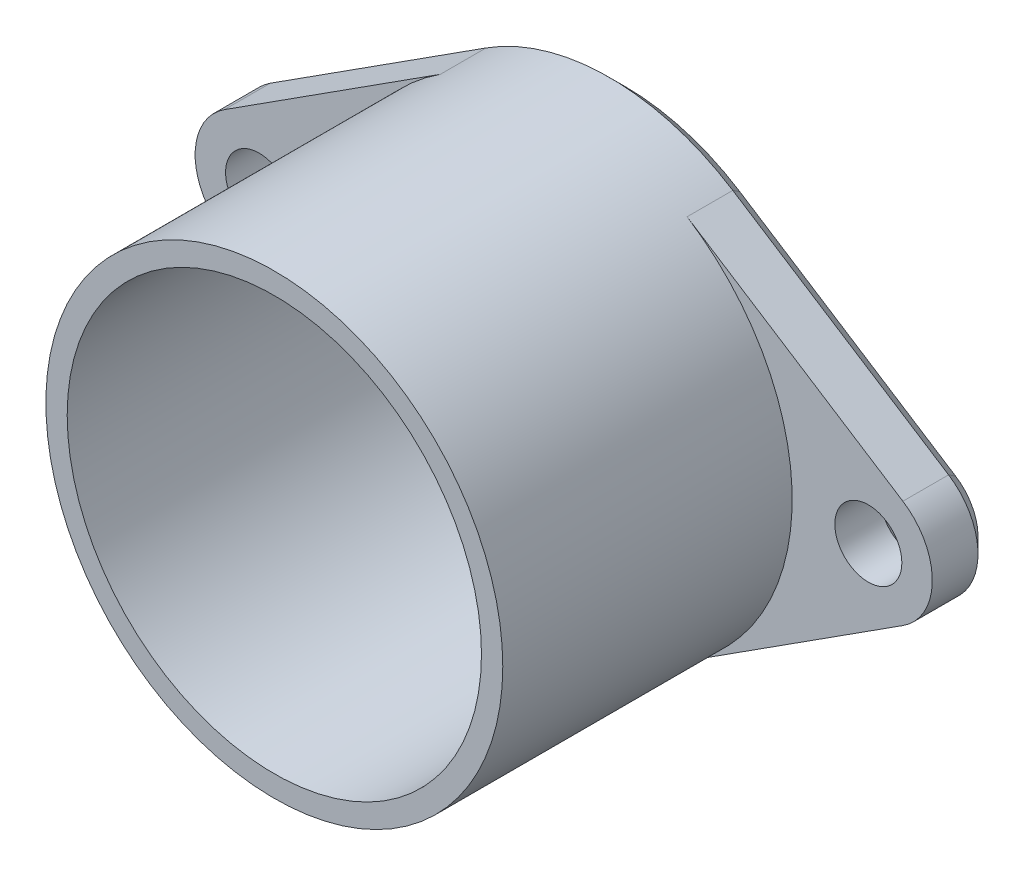
ISO-10303-21;
HEADER;
FILE_DESCRIPTION(('STEP AP214'),'2;1');
FILE_NAME('part.step','',(''),(''),'','','');
FILE_SCHEMA(('AUTOMOTIVE_DESIGN { 1 0 10303 214 1 1 1 1 }'));
ENDSEC;
DATA;
#1=APPLICATION_CONTEXT('core data for automotive mechanical design processes');
#2=APPLICATION_PROTOCOL_DEFINITION('international standard','automotive_design',2000,#1);
#3=PRODUCT_CONTEXT('',#1,'mechanical');
#4=PRODUCT('Part','Part','',(#3));
#5=PRODUCT_RELATED_PRODUCT_CATEGORY('part','',(#4));
#6=PRODUCT_DEFINITION_FORMATION('','',#4);
#7=PRODUCT_DEFINITION_CONTEXT('part definition',#1,'design');
#8=PRODUCT_DEFINITION('design','',#6,#7);
#9=PRODUCT_DEFINITION_SHAPE('','',#8);
#10=(LENGTH_UNIT() NAMED_UNIT(*) SI_UNIT(.MILLI.,.METRE.));
#11=(NAMED_UNIT(*) PLANE_ANGLE_UNIT() SI_UNIT($,.RADIAN.));
#12=(NAMED_UNIT(*) SI_UNIT($,.STERADIAN.) SOLID_ANGLE_UNIT());
#13=UNCERTAINTY_MEASURE_WITH_UNIT(LENGTH_MEASURE(1.E-05),#10,'distance_accuracy_value','');
#14=(GEOMETRIC_REPRESENTATION_CONTEXT(3) GLOBAL_UNCERTAINTY_ASSIGNED_CONTEXT((#13)) GLOBAL_UNIT_ASSIGNED_CONTEXT((#10,
#11,#12)) REPRESENTATION_CONTEXT('',''));
#15=CARTESIAN_POINT('',(0.,0.,0.));
#16=DIRECTION('',(0.,0.,1.));
#17=DIRECTION('',(1.,0.,0.));
#18=AXIS2_PLACEMENT_3D('',#15,#16,#17);
#19=CARTESIAN_POINT('',(0.,0.,2.));
#20=DIRECTION('',(0.,0.,-1.));
#21=DIRECTION('',(-1.,0.,0.));
#22=AXIS2_PLACEMENT_3D('',#19,#20,#21);
#23=CYLINDRICAL_SURFACE('',#22,1.7);
#24=CARTESIAN_POINT('',(0.,0.,0.500000000000002));
#25=DIRECTION('',(0.,0.,1.));
#26=DIRECTION('',(1.,0.,0.));
#27=AXIS2_PLACEMENT_3D('',#24,#25,#26);
#28=CIRCLE('',#27,1.7);
#29=CARTESIAN_POINT('',(1.7,0.,0.500000000000002));
#30=VERTEX_POINT('',#29);
#31=EDGE_CURVE('E238',#30,#30,#28,.F.);
#32=ORIENTED_EDGE('',*,*,#31,.T.);
#33=EDGE_LOOP('',(#32));
#34=FACE_BOUND('',#33,.T.);
#35=CARTESIAN_POINT('',(0.,0.,0.6));
#36=DIRECTION('',(0.,0.,1.));
#37=DIRECTION('',(1.,0.,0.));
#38=AXIS2_PLACEMENT_3D('',#35,#36,#37);
#39=CIRCLE('',#38,1.7);
#40=CARTESIAN_POINT('',(1.7,0.,0.6));
#41=VERTEX_POINT('',#40);
#42=EDGE_CURVE('E203',#41,#41,#39,.T.);
#43=ORIENTED_EDGE('',*,*,#42,.T.);
#44=EDGE_LOOP('',(#43));
#45=FACE_BOUND('',#44,.T.);
#46=ADVANCED_FACE('F43',(#34,#45),#23,.F.);
#47=CARTESIAN_POINT('',(0.,4.5,2.));
#48=DIRECTION('',(0.,0.,-1.));
#49=DIRECTION('',(-1.,0.,0.));
#50=AXIS2_PLACEMENT_3D('',#47,#48,#49);
#51=CYLINDRICAL_SURFACE('',#50,1.);
#52=CARTESIAN_POINT('',(0.,4.5,0.500000000000001));
#53=DIRECTION('',(0.,0.,1.));
#54=DIRECTION('',(1.,0.,0.));
#55=AXIS2_PLACEMENT_3D('',#52,#53,#54);
#56=CIRCLE('',#55,1.);
#57=CARTESIAN_POINT('',(1.,4.5,0.500000000000001));
#58=VERTEX_POINT('',#57);
#59=EDGE_CURVE('E244',#58,#58,#56,.F.);
#60=ORIENTED_EDGE('',*,*,#59,.T.);
#61=EDGE_LOOP('',(#60));
#62=FACE_BOUND('',#61,.T.);
#63=CARTESIAN_POINT('',(0.,4.5,1.5));
#64=DIRECTION('',(0.,0.,1.));
#65=DIRECTION('',(1.,0.,0.));
#66=AXIS2_PLACEMENT_3D('',#63,#64,#65);
#67=CIRCLE('',#66,1.);
#68=CARTESIAN_POINT('',(1.,4.5,1.5));
#69=VERTEX_POINT('',#68);
#70=EDGE_CURVE('E176',#69,#69,#67,.T.);
#71=ORIENTED_EDGE('',*,*,#70,.T.);
#72=EDGE_LOOP('',(#71));
#73=FACE_BOUND('',#72,.T.);
#74=ADVANCED_FACE('F309',(#62,#73),#51,.F.);
#75=CARTESIAN_POINT('',(0.,-4.5,2.));
#76=DIRECTION('',(0.,0.,-1.));
#77=DIRECTION('',(-1.,0.,0.));
#78=AXIS2_PLACEMENT_3D('',#75,#76,#77);
#79=CYLINDRICAL_SURFACE('',#78,1.);
#80=CARTESIAN_POINT('',(0.,-4.5,0.500000000000002));
#81=DIRECTION('',(0.,0.,1.));
#82=DIRECTION('',(1.,0.,0.));
#83=AXIS2_PLACEMENT_3D('',#80,#81,#82);
#84=CIRCLE('',#83,1.);
#85=CARTESIAN_POINT('',(1.,-4.5,0.500000000000002));
#86=VERTEX_POINT('',#85);
#87=EDGE_CURVE('E241',#86,#86,#84,.F.);
#88=ORIENTED_EDGE('',*,*,#87,.T.);
#89=EDGE_LOOP('',(#88));
#90=FACE_BOUND('',#89,.T.);
#91=CARTESIAN_POINT('',(0.,-4.5,1.5));
#92=DIRECTION('',(0.,0.,1.));
#93=DIRECTION('',(1.,0.,0.));
#94=AXIS2_PLACEMENT_3D('',#91,#92,#93);
#95=CIRCLE('',#94,1.);
#96=CARTESIAN_POINT('',(1.,-4.5,1.5));
#97=VERTEX_POINT('',#96);
#98=EDGE_CURVE('E304',#97,#97,#95,.T.);
#99=ORIENTED_EDGE('',*,*,#98,.T.);
#100=EDGE_LOOP('',(#99));
#101=FACE_BOUND('',#100,.T.);
#102=ADVANCED_FACE('F342',(#90,#101),#79,.F.);
#103=CARTESIAN_POINT('',(0.,0.,2.));
#104=DIRECTION('',(0.,0.,1.));
#105=DIRECTION('',(1.,0.,0.));
#106=AXIS2_PLACEMENT_3D('',#103,#104,#105);
#107=PLANE('',#106);
#108=CARTESIAN_POINT('',(0.,0.,2.));
#109=DIRECTION('',(0.,0.,1.));
#110=DIRECTION('',(1.,0.,0.));
#111=AXIS2_PLACEMENT_3D('',#108,#109,#110);
#112=CIRCLE('',#111,7.5);
#113=CARTESIAN_POINT('',(-4.05,6.31248762375024,2.));
#114=VERTEX_POINT('',#113);
#115=CARTESIAN_POINT('',(-4.05,-6.31248762375024,2.));
#116=VERTEX_POINT('',#115);
#117=EDGE_CURVE('E161',#114,#116,#112,.T.);
#118=ORIENTED_EDGE('',*,*,#117,.F.);
#119=DIRECTION('',(-0.841665016500032,-0.54,0.));
#120=VECTOR('',#119,1.);
#121=CARTESIAN_POINT('',(-4.05,6.31248762375024,2.));
#122=LINE('',#121,#120);
#123=CARTESIAN_POINT('',(-11.134,1.76749653465007,2.));
#124=VERTEX_POINT('',#123);
#125=EDGE_CURVE('E183',#114,#124,#122,.T.);
#126=ORIENTED_EDGE('',*,*,#125,.T.);
#127=CARTESIAN_POINT('',(-10.,0.,2.));
#128=DIRECTION('',(0.,0.,1.));
#129=DIRECTION('',(-1.,0.,0.));
#130=AXIS2_PLACEMENT_3D('',#127,#128,#129);
#131=CIRCLE('',#130,2.1);
#132=CARTESIAN_POINT('',(-11.134,-1.76749653465007,2.));
#133=VERTEX_POINT('',#132);
#134=EDGE_CURVE('E185',#124,#133,#131,.T.);
#135=ORIENTED_EDGE('',*,*,#134,.T.);
#136=DIRECTION('',(0.841665016500032,-0.54,0.));
#137=VECTOR('',#136,1.);
#138=CARTESIAN_POINT('',(-4.05,-6.31248762375024,2.));
#139=LINE('',#138,#137);
#140=EDGE_CURVE('E187',#133,#116,#139,.T.);
#141=ORIENTED_EDGE('',*,*,#140,.T.);
#142=EDGE_LOOP('',(#118,#126,#135,#141));
#143=FACE_BOUND('',#142,.T.);
#144=CARTESIAN_POINT('',(-10.,0.,2.));
#145=DIRECTION('',(0.,0.,1.));
#146=DIRECTION('',(1.,0.,0.));
#147=AXIS2_PLACEMENT_3D('',#144,#145,#146);
#148=CIRCLE('',#147,1.1);
#149=CARTESIAN_POINT('',(-8.9,0.,2.));
#150=VERTEX_POINT('',#149);
#151=EDGE_CURVE('E177',#150,#150,#148,.T.);
#152=ORIENTED_EDGE('',*,*,#151,.F.);
#153=EDGE_LOOP('',(#152));
#154=FACE_BOUND('',#153,.T.);
#155=ADVANCED_FACE('F348',(#143,#154),#107,.T.);
#156=CARTESIAN_POINT('',(4.05,-6.31248762375024,2.));
#157=VERTEX_POINT('',#156);
#158=CARTESIAN_POINT('',(4.05,6.31248762375025,2.));
#159=VERTEX_POINT('',#158);
#160=EDGE_CURVE('E151',#157,#159,#112,.T.);
#161=ORIENTED_EDGE('',*,*,#160,.F.);
#162=DIRECTION('',(0.841665016500032,0.54,0.));
#163=VECTOR('',#162,1.);
#164=CARTESIAN_POINT('',(11.134,-1.76749653465007,2.));
#165=LINE('',#164,#163);
#166=CARTESIAN_POINT('',(11.134,-1.76749653465006,2.));
#167=VERTEX_POINT('',#166);
#168=EDGE_CURVE('E189',#157,#167,#165,.T.);
#169=ORIENTED_EDGE('',*,*,#168,.T.);
#170=CARTESIAN_POINT('',(10.,0.,2.));
#171=DIRECTION('',(0.,0.,1.));
#172=DIRECTION('',(-1.,0.,0.));
#173=AXIS2_PLACEMENT_3D('',#170,#171,#172);
#174=CIRCLE('',#173,2.1);
#175=CARTESIAN_POINT('',(11.134,1.76749653465007,2.));
#176=VERTEX_POINT('',#175);
#177=EDGE_CURVE('E154',#167,#176,#174,.T.);
#178=ORIENTED_EDGE('',*,*,#177,.T.);
#179=DIRECTION('',(-0.841665016500033,0.54,0.));
#180=VECTOR('',#179,1.);
#181=CARTESIAN_POINT('',(4.05,6.31248762375024,2.));
#182=LINE('',#181,#180);
#183=EDGE_CURVE('E141',#176,#159,#182,.T.);
#184=ORIENTED_EDGE('',*,*,#183,.T.);
#185=EDGE_LOOP('',(#161,#169,#178,#184));
#186=FACE_BOUND('',#185,.T.);
#187=CARTESIAN_POINT('',(10.,0.,2.));
#188=DIRECTION('',(0.,0.,1.));
#189=DIRECTION('',(1.,0.,0.));
#190=AXIS2_PLACEMENT_3D('',#187,#188,#189);
#191=CIRCLE('',#190,1.1);
#192=CARTESIAN_POINT('',(11.1,0.,2.));
#193=VERTEX_POINT('',#192);
#194=EDGE_CURVE('E180',#193,#193,#191,.T.);
#195=ORIENTED_EDGE('',*,*,#194,.F.);
#196=EDGE_LOOP('',(#195));
#197=FACE_BOUND('',#196,.T.);
#198=ADVANCED_FACE('F149',(#186,#197),#107,.T.);
#199=CARTESIAN_POINT('',(0.,0.,0.));
#200=DIRECTION('',(0.,0.,1.));
#201=DIRECTION('',(1.,0.,0.));
#202=AXIS2_PLACEMENT_3D('',#199,#200,#201);
#203=PLANE('',#202);
#204=CARTESIAN_POINT('',(0.,0.,0.));
#205=DIRECTION('',(0.,0.,1.));
#206=DIRECTION('',(1.,0.,0.));
#207=AXIS2_PLACEMENT_3D('',#204,#205,#206);
#208=CIRCLE('',#207,2.2);
#209=CARTESIAN_POINT('',(2.2,0.,0.));
#210=VERTEX_POINT('',#209);
#211=EDGE_CURVE('E232',#210,#210,#208,.T.);
#212=ORIENTED_EDGE('',*,*,#211,.T.);
#213=EDGE_LOOP('',(#212));
#214=FACE_BOUND('',#213,.T.);
#215=CARTESIAN_POINT('',(0.,-4.5,0.));
#216=DIRECTION('',(0.,0.,1.));
#217=DIRECTION('',(1.,0.,0.));
#218=AXIS2_PLACEMENT_3D('',#215,#216,#217);
#219=CIRCLE('',#218,1.5);
#220=CARTESIAN_POINT('',(1.5,-4.5,0.));
#221=VERTEX_POINT('',#220);
#222=EDGE_CURVE('E229',#221,#221,#219,.T.);
#223=ORIENTED_EDGE('',*,*,#222,.T.);
#224=EDGE_LOOP('',(#223));
#225=FACE_BOUND('',#224,.T.);
#226=CARTESIAN_POINT('',(0.,4.5,0.));
#227=DIRECTION('',(0.,0.,1.));
#228=DIRECTION('',(1.,0.,0.));
#229=AXIS2_PLACEMENT_3D('',#226,#227,#228);
#230=CIRCLE('',#229,1.5);
#231=CARTESIAN_POINT('',(1.5,4.5,0.));
#232=VERTEX_POINT('',#231);
#233=EDGE_CURVE('E226',#232,#232,#230,.T.);
#234=ORIENTED_EDGE('',*,*,#233,.T.);
#235=EDGE_LOOP('',(#234));
#236=FACE_BOUND('',#235,.T.);
#237=DIRECTION('',(-0.841665016500033,0.54,0.));
#238=VECTOR('',#237,1.);
#239=CARTESIAN_POINT('',(-3.78,-5.89165511550023,0.));
#240=LINE('',#239,#238);
#241=CARTESIAN_POINT('',(-3.78,-5.89165511550023,0.));
#242=VERTEX_POINT('',#241);
#243=CARTESIAN_POINT('',(-10.864,-1.34666402640005,0.));
#244=VERTEX_POINT('',#243);
#245=EDGE_CURVE('E222',#242,#244,#240,.T.);
#246=ORIENTED_EDGE('',*,*,#245,.T.);
#247=CARTESIAN_POINT('',(-10.,0.,0.));
#248=DIRECTION('',(0.,0.,1.));
#249=DIRECTION('',(1.,0.,0.));
#250=AXIS2_PLACEMENT_3D('',#247,#248,#249);
#251=CIRCLE('',#250,1.59999999999999);
#252=CARTESIAN_POINT('',(-8.40000000000001,0.,0.));
#253=VERTEX_POINT('',#252);
#254=EDGE_CURVE('E224',#244,#253,#251,.T.);
#255=ORIENTED_EDGE('',*,*,#254,.T.);
#256=CARTESIAN_POINT('',(-10.,0.,0.));
#257=DIRECTION('',(0.,0.,1.));
#258=DIRECTION('',(1.,0.,0.));
#259=AXIS2_PLACEMENT_3D('',#256,#257,#258);
#260=CIRCLE('',#259,1.59999999999999);
#261=CARTESIAN_POINT('',(-10.864,1.34666402640005,0.));
#262=VERTEX_POINT('',#261);
#263=EDGE_CURVE('E215',#253,#262,#260,.T.);
#264=ORIENTED_EDGE('',*,*,#263,.T.);
#265=DIRECTION('',(0.841665016500033,0.54,0.));
#266=VECTOR('',#265,1.);
#267=CARTESIAN_POINT('',(-3.78,5.89165511550023,0.));
#268=LINE('',#267,#266);
#269=CARTESIAN_POINT('',(-3.78,5.89165511550023,0.));
#270=VERTEX_POINT('',#269);
#271=EDGE_CURVE('E211',#262,#270,#268,.T.);
#272=ORIENTED_EDGE('',*,*,#271,.T.);
#273=CARTESIAN_POINT('',(0.,0.,0.));
#274=DIRECTION('',(0.,0.,1.));
#275=DIRECTION('',(1.,0.,0.));
#276=AXIS2_PLACEMENT_3D('',#273,#274,#275);
#277=CIRCLE('',#276,7.);
#278=CARTESIAN_POINT('',(3.78,5.89165511550023,0.));
#279=VERTEX_POINT('',#278);
#280=EDGE_CURVE('E165',#270,#279,#277,.F.);
#281=ORIENTED_EDGE('',*,*,#280,.T.);
#282=DIRECTION('',(0.841665016500033,-0.54,0.));
#283=VECTOR('',#282,1.);
#284=CARTESIAN_POINT('',(3.78,5.89165511550023,0.));
#285=LINE('',#284,#283);
#286=CARTESIAN_POINT('',(10.864,1.34666402640006,0.));
#287=VERTEX_POINT('',#286);
#288=EDGE_CURVE('E209',#279,#287,#285,.T.);
#289=ORIENTED_EDGE('',*,*,#288,.T.);
#290=CARTESIAN_POINT('',(10.,0.,0.));
#291=DIRECTION('',(0.,0.,1.));
#292=DIRECTION('',(1.,0.,0.));
#293=AXIS2_PLACEMENT_3D('',#290,#291,#292);
#294=CIRCLE('',#293,1.59999999999999);
#295=CARTESIAN_POINT('',(10.864,-1.34666402640005,0.));
#296=VERTEX_POINT('',#295);
#297=EDGE_CURVE('E213',#287,#296,#294,.T.);
#298=ORIENTED_EDGE('',*,*,#297,.T.);
#299=DIRECTION('',(-0.841665016500032,-0.54,0.));
#300=VECTOR('',#299,1.);
#301=CARTESIAN_POINT('',(3.78,-5.89165511550023,0.));
#302=LINE('',#301,#300);
#303=CARTESIAN_POINT('',(3.78,-5.89165511550023,0.));
#304=VERTEX_POINT('',#303);
#305=EDGE_CURVE('E218',#296,#304,#302,.T.);
#306=ORIENTED_EDGE('',*,*,#305,.T.);
#307=CARTESIAN_POINT('',(0.,0.,0.));
#308=DIRECTION('',(0.,0.,1.));
#309=DIRECTION('',(1.,0.,0.));
#310=AXIS2_PLACEMENT_3D('',#307,#308,#309);
#311=CIRCLE('',#310,7.);
#312=EDGE_CURVE('E220',#304,#242,#311,.F.);
#313=ORIENTED_EDGE('',*,*,#312,.T.);
#314=EDGE_LOOP('',(#246,#255,#264,#272,#281,#289,#298,#306,#313));
#315=FACE_BOUND('',#314,.T.);
#316=ADVANCED_FACE('F356',(#214,#225,#236,#315),#203,.F.);
#317=CARTESIAN_POINT('',(-4.05,6.31248762375024,2.));
#318=DIRECTION('',(0.54,-0.841665016500032,0.));
#319=DIRECTION('',(0.841665016500032,0.54,0.));
#320=AXIS2_PLACEMENT_3D('',#317,#318,#319);
#321=PLANE('',#320);
#322=DIRECTION('',(0.,0.,-1.));
#323=VECTOR('',#322,1.);
#324=CARTESIAN_POINT('',(-4.05,6.31248762375024,2.));
#325=LINE('',#324,#323);
#326=CARTESIAN_POINT('',(-4.05,6.31248762375024,0.499999999999996));
#327=VERTEX_POINT('',#326);
#328=EDGE_CURVE('E162',#114,#327,#325,.T.);
#329=ORIENTED_EDGE('',*,*,#328,.T.);
#330=DIRECTION('',(-0.841665016500032,-0.54,0.));
#331=VECTOR('',#330,1.);
#332=CARTESIAN_POINT('',(-4.05,6.31248762375024,0.499999999999996));
#333=LINE('',#332,#331);
#334=CARTESIAN_POINT('',(-11.134,1.76749653465007,0.499999999999996));
#335=VERTEX_POINT('',#334);
#336=EDGE_CURVE('E250',#327,#335,#333,.T.);
#337=ORIENTED_EDGE('',*,*,#336,.T.);
#338=DIRECTION('',(0.,0.,-1.));
#339=VECTOR('',#338,1.);
#340=CARTESIAN_POINT('',(-11.134,1.76749653465007,2.));
#341=LINE('',#340,#339);
#342=EDGE_CURVE('E167',#124,#335,#341,.T.);
#343=ORIENTED_EDGE('',*,*,#342,.F.);
#344=ORIENTED_EDGE('',*,*,#125,.F.);
#345=EDGE_LOOP('',(#329,#337,#343,#344));
#346=FACE_BOUND('',#345,.T.);
#347=ADVANCED_FACE('F359',(#346),#321,.F.);
#348=CARTESIAN_POINT('',(-10.,0.,2.));
#349=DIRECTION('',(0.,0.,-1.));
#350=DIRECTION('',(-1.,0.,0.));
#351=AXIS2_PLACEMENT_3D('',#348,#349,#350);
#352=CYLINDRICAL_SURFACE('',#351,2.1);
#353=ORIENTED_EDGE('',*,*,#342,.T.);
#354=CARTESIAN_POINT('',(-10.,0.,0.499999999999996));
#355=DIRECTION('',(0.,0.,1.));
#356=DIRECTION('',(1.,0.,0.));
#357=AXIS2_PLACEMENT_3D('',#354,#355,#356);
#358=CIRCLE('',#357,2.1);
#359=CARTESIAN_POINT('',(-11.134,-1.76749653465007,0.499999999999996));
#360=VERTEX_POINT('',#359);
#361=EDGE_CURVE('E253',#335,#360,#358,.T.);
#362=ORIENTED_EDGE('',*,*,#361,.T.);
#363=DIRECTION('',(0.,0.,-1.));
#364=VECTOR('',#363,1.);
#365=CARTESIAN_POINT('',(-11.134,-1.76749653465007,2.));
#366=LINE('',#365,#364);
#367=EDGE_CURVE('E198',#133,#360,#366,.T.);
#368=ORIENTED_EDGE('',*,*,#367,.F.);
#369=ORIENTED_EDGE('',*,*,#134,.F.);
#370=EDGE_LOOP('',(#353,#362,#368,#369));
#371=FACE_BOUND('',#370,.T.);
#372=ADVANCED_FACE('F374',(#371),#352,.T.);
#373=CARTESIAN_POINT('',(-4.05,-6.31248762375024,2.));
#374=DIRECTION('',(0.54,0.841665016500033,0.));
#375=DIRECTION('',(-0.841665016500033,0.54,0.));
#376=AXIS2_PLACEMENT_3D('',#373,#374,#375);
#377=PLANE('',#376);
#378=ORIENTED_EDGE('',*,*,#367,.T.);
#379=DIRECTION('',(0.841665016500033,-0.54,0.));
#380=VECTOR('',#379,1.);
#381=CARTESIAN_POINT('',(-4.05,-6.31248762375024,0.499999999999996));
#382=LINE('',#381,#380);
#383=CARTESIAN_POINT('',(-4.05,-6.31248762375024,0.499999999999996));
#384=VERTEX_POINT('',#383);
#385=EDGE_CURVE('E255',#360,#384,#382,.T.);
#386=ORIENTED_EDGE('',*,*,#385,.T.);
#387=DIRECTION('',(0.,0.,-1.));
#388=VECTOR('',#387,1.);
#389=CARTESIAN_POINT('',(-4.05,-6.31248762375024,2.));
#390=LINE('',#389,#388);
#391=EDGE_CURVE('E196',#116,#384,#390,.T.);
#392=ORIENTED_EDGE('',*,*,#391,.F.);
#393=ORIENTED_EDGE('',*,*,#140,.F.);
#394=EDGE_LOOP('',(#378,#386,#392,#393));
#395=FACE_BOUND('',#394,.T.);
#396=ADVANCED_FACE('F371',(#395),#377,.F.);
#397=CARTESIAN_POINT('',(0.,0.,2.));
#398=DIRECTION('',(0.,0.,-1.));
#399=DIRECTION('',(-1.,0.,0.));
#400=AXIS2_PLACEMENT_3D('',#397,#398,#399);
#401=CYLINDRICAL_SURFACE('',#400,7.5);
#402=ORIENTED_EDGE('',*,*,#391,.T.);
#403=CARTESIAN_POINT('',(0.,0.,0.499999999999996));
#404=DIRECTION('',(0.,0.,1.));
#405=DIRECTION('',(1.,0.,0.));
#406=AXIS2_PLACEMENT_3D('',#403,#404,#405);
#407=CIRCLE('',#406,7.5);
#408=CARTESIAN_POINT('',(4.05,-6.31248762375024,0.499999999999996));
#409=VERTEX_POINT('',#408);
#410=EDGE_CURVE('E259',#384,#409,#407,.T.);
#411=ORIENTED_EDGE('',*,*,#410,.T.);
#412=DIRECTION('',(0.,0.,-1.));
#413=VECTOR('',#412,1.);
#414=CARTESIAN_POINT('',(4.05,-6.31248762375024,2.));
#415=LINE('',#414,#413);
#416=EDGE_CURVE('E159',#157,#409,#415,.T.);
#417=ORIENTED_EDGE('',*,*,#416,.F.);
#418=ORIENTED_EDGE('',*,*,#160,.T.);
#419=DIRECTION('',(0.,0.,-1.));
#420=VECTOR('',#419,1.);
#421=CARTESIAN_POINT('',(4.05,6.31248762375024,2.));
#422=LINE('',#421,#420);
#423=CARTESIAN_POINT('',(4.05,6.31248762375024,0.499999999999996));
#424=VERTEX_POINT('',#423);
#425=EDGE_CURVE('E138',#159,#424,#422,.T.);
#426=ORIENTED_EDGE('',*,*,#425,.T.);
#427=CARTESIAN_POINT('',(0.,0.,0.499999999999996));
#428=DIRECTION('',(0.,0.,1.));
#429=DIRECTION('',(1.,0.,0.));
#430=AXIS2_PLACEMENT_3D('',#427,#428,#429);
#431=CIRCLE('',#430,7.5);
#432=EDGE_CURVE('E257',#424,#327,#431,.T.);
#433=ORIENTED_EDGE('',*,*,#432,.T.);
#434=ORIENTED_EDGE('',*,*,#328,.F.);
#435=ORIENTED_EDGE('',*,*,#117,.T.);
#436=EDGE_LOOP('',(#402,#411,#417,#418,#426,#433,#434,#435));
#437=FACE_BOUND('',#436,.T.);
#438=CARTESIAN_POINT('',(0.,0.,11.5));
#439=DIRECTION('',(0.,0.,1.));
#440=DIRECTION('',(1.,0.,0.));
#441=AXIS2_PLACEMENT_3D('',#438,#439,#440);
#442=CIRCLE('',#441,7.5);
#443=CARTESIAN_POINT('',(7.5,0.,11.5));
#444=VERTEX_POINT('',#443);
#445=EDGE_CURVE('E171',#444,#444,#442,.T.);
#446=ORIENTED_EDGE('',*,*,#445,.F.);
#447=EDGE_LOOP('',(#446));
#448=FACE_BOUND('',#447,.T.);
#449=ADVANCED_FACE('F157',(#437,#448),#401,.T.);
#450=CARTESIAN_POINT('',(11.134,-1.76749653465007,2.));
#451=DIRECTION('',(-0.54,0.841665016500032,0.));
#452=DIRECTION('',(-0.841665016500032,-0.54,0.));
#453=AXIS2_PLACEMENT_3D('',#450,#451,#452);
#454=PLANE('',#453);
#455=ORIENTED_EDGE('',*,*,#416,.T.);
#456=DIRECTION('',(0.841665016500032,0.54,0.));
#457=VECTOR('',#456,1.);
#458=CARTESIAN_POINT('',(11.134,-1.76749653465007,0.499999999999996));
#459=LINE('',#458,#457);
#460=CARTESIAN_POINT('',(11.134,-1.76749653465006,0.499999999999996));
#461=VERTEX_POINT('',#460);
#462=EDGE_CURVE('E67',#409,#461,#459,.T.);
#463=ORIENTED_EDGE('',*,*,#462,.T.);
#464=DIRECTION('',(0.,0.,-1.));
#465=VECTOR('',#464,1.);
#466=CARTESIAN_POINT('',(11.134,-1.76749653465006,2.));
#467=LINE('',#466,#465);
#468=EDGE_CURVE('E193',#167,#461,#467,.T.);
#469=ORIENTED_EDGE('',*,*,#468,.F.);
#470=ORIENTED_EDGE('',*,*,#168,.F.);
#471=EDGE_LOOP('',(#455,#463,#469,#470));
#472=FACE_BOUND('',#471,.T.);
#473=ADVANCED_FACE('F366',(#472),#454,.F.);
#474=CARTESIAN_POINT('',(10.,0.,2.));
#475=DIRECTION('',(0.,0.,-1.));
#476=DIRECTION('',(-1.,0.,0.));
#477=AXIS2_PLACEMENT_3D('',#474,#475,#476);
#478=CYLINDRICAL_SURFACE('',#477,2.1);
#479=ORIENTED_EDGE('',*,*,#468,.T.);
#480=CARTESIAN_POINT('',(10.,0.,0.499999999999996));
#481=DIRECTION('',(0.,0.,1.));
#482=DIRECTION('',(1.,0.,0.));
#483=AXIS2_PLACEMENT_3D('',#480,#481,#482);
#484=CIRCLE('',#483,2.1);
#485=CARTESIAN_POINT('',(11.134,1.76749653465007,0.499999999999996));
#486=VERTEX_POINT('',#485);
#487=EDGE_CURVE('E52',#461,#486,#484,.T.);
#488=ORIENTED_EDGE('',*,*,#487,.T.);
#489=DIRECTION('',(0.,0.,-1.));
#490=VECTOR('',#489,1.);
#491=CARTESIAN_POINT('',(11.134,1.76749653465007,2.));
#492=LINE('',#491,#490);
#493=EDGE_CURVE('E146',#176,#486,#492,.T.);
#494=ORIENTED_EDGE('',*,*,#493,.F.);
#495=ORIENTED_EDGE('',*,*,#177,.F.);
#496=EDGE_LOOP('',(#479,#488,#494,#495));
#497=FACE_BOUND('',#496,.T.);
#498=ADVANCED_FACE('F363',(#497),#478,.T.);
#499=CARTESIAN_POINT('',(4.05,6.31248762375024,2.));
#500=DIRECTION('',(-0.54,-0.841665016500033,0.));
#501=DIRECTION('',(0.841665016500033,-0.54,0.));
#502=AXIS2_PLACEMENT_3D('',#499,#500,#501);
#503=PLANE('',#502);
#504=ORIENTED_EDGE('',*,*,#493,.T.);
#505=DIRECTION('',(-0.841665016500033,0.54,0.));
#506=VECTOR('',#505,1.);
#507=CARTESIAN_POINT('',(4.05,6.31248762375024,0.499999999999996));
#508=LINE('',#507,#506);
#509=EDGE_CURVE('E13',#486,#424,#508,.T.);
#510=ORIENTED_EDGE('',*,*,#509,.T.);
#511=ORIENTED_EDGE('',*,*,#425,.F.);
#512=ORIENTED_EDGE('',*,*,#183,.F.);
#513=EDGE_LOOP('',(#504,#510,#511,#512));
#514=FACE_BOUND('',#513,.T.);
#515=ADVANCED_FACE('F140',(#514),#503,.F.);
#516=CARTESIAN_POINT('',(10.,0.,2.));
#517=DIRECTION('',(0.,0.,-1.));
#518=DIRECTION('',(-1.,0.,0.));
#519=AXIS2_PLACEMENT_3D('',#516,#517,#518);
#520=CYLINDRICAL_SURFACE('',#519,1.1);
#521=CARTESIAN_POINT('',(10.,0.,0.5));
#522=DIRECTION('',(0.,0.,1.));
#523=DIRECTION('',(1.,0.,0.));
#524=AXIS2_PLACEMENT_3D('',#521,#522,#523);
#525=CIRCLE('',#524,1.1);
#526=CARTESIAN_POINT('',(11.1,0.,0.5));
#527=VERTEX_POINT('',#526);
#528=EDGE_CURVE('E247',#527,#527,#525,.F.);
#529=ORIENTED_EDGE('',*,*,#528,.T.);
#530=EDGE_LOOP('',(#529));
#531=FACE_BOUND('',#530,.T.);
#532=ORIENTED_EDGE('',*,*,#194,.T.);
#533=EDGE_LOOP('',(#532));
#534=FACE_BOUND('',#533,.T.);
#535=ADVANCED_FACE('F333',(#531,#534),#520,.F.);
#536=CARTESIAN_POINT('',(-10.,0.,2.));
#537=DIRECTION('',(0.,0.,-1.));
#538=DIRECTION('',(-1.,0.,0.));
#539=AXIS2_PLACEMENT_3D('',#536,#537,#538);
#540=CYLINDRICAL_SURFACE('',#539,1.1);
#541=CARTESIAN_POINT('',(-10.,0.,0.5));
#542=DIRECTION('',(0.,0.,1.));
#543=DIRECTION('',(1.,0.,0.));
#544=AXIS2_PLACEMENT_3D('',#541,#542,#543);
#545=CIRCLE('',#544,1.1);
#546=CARTESIAN_POINT('',(-8.9,0.,0.5));
#547=VERTEX_POINT('',#546);
#548=EDGE_CURVE('E235',#547,#547,#545,.F.);
#549=ORIENTED_EDGE('',*,*,#548,.T.);
#550=EDGE_LOOP('',(#549));
#551=FACE_BOUND('',#550,.T.);
#552=ORIENTED_EDGE('',*,*,#151,.T.);
#553=EDGE_LOOP('',(#552));
#554=FACE_BOUND('',#553,.T.);
#555=ADVANCED_FACE('F324',(#551,#554),#540,.F.);
#556=CARTESIAN_POINT('',(0.,0.,44.2132034355964));
#557=DIRECTION('',(0.,0.,-1.));
#558=DIRECTION('',(-1.,0.,0.));
#559=AXIS2_PLACEMENT_3D('',#556,#557,#558);
#560=CYLINDRICAL_SURFACE('',#559,6.8);
#561=CARTESIAN_POINT('',(0.,0.,11.5));
#562=DIRECTION('',(0.,0.,1.));
#563=DIRECTION('',(1.,0.,0.));
#564=AXIS2_PLACEMENT_3D('',#561,#562,#563);
#565=CIRCLE('',#564,6.8);
#566=CARTESIAN_POINT('',(6.8,0.,11.5));
#567=VERTEX_POINT('',#566);
#568=EDGE_CURVE('E173',#567,#567,#565,.T.);
#569=ORIENTED_EDGE('',*,*,#568,.T.);
#570=EDGE_LOOP('',(#569));
#571=FACE_BOUND('',#570,.T.);
#572=CARTESIAN_POINT('',(0.,0.,1.5));
#573=DIRECTION('',(0.,0.,1.));
#574=DIRECTION('',(1.,0.,0.));
#575=AXIS2_PLACEMENT_3D('',#572,#573,#574);
#576=CIRCLE('',#575,6.8);
#577=CARTESIAN_POINT('',(6.8,0.,1.5));
#578=VERTEX_POINT('',#577);
#579=EDGE_CURVE('E206',#578,#578,#576,.T.);
#580=ORIENTED_EDGE('',*,*,#579,.F.);
#581=EDGE_LOOP('',(#580));
#582=FACE_BOUND('',#581,.T.);
#583=ADVANCED_FACE('F322',(#571,#582),#560,.F.);
#584=CARTESIAN_POINT('',(0.,0.,11.5));
#585=DIRECTION('',(0.,0.,1.));
#586=DIRECTION('',(1.,0.,0.));
#587=AXIS2_PLACEMENT_3D('',#584,#585,#586);
#588=PLANE('',#587);
#589=ORIENTED_EDGE('',*,*,#568,.F.);
#590=EDGE_LOOP('',(#589));
#591=FACE_BOUND('',#590,.T.);
#592=ORIENTED_EDGE('',*,*,#445,.T.);
#593=EDGE_LOOP('',(#592));
#594=FACE_BOUND('',#593,.T.);
#595=ADVANCED_FACE('F315',(#591,#594),#588,.T.);
#596=CARTESIAN_POINT('',(0.,0.,1.5));
#597=DIRECTION('',(0.,0.,1.));
#598=DIRECTION('',(1.,0.,0.));
#599=AXIS2_PLACEMENT_3D('',#596,#597,#598);
#600=PLANE('',#599);
#601=CARTESIAN_POINT('',(0.,0.,1.5));
#602=DIRECTION('',(0.,0.,1.));
#603=DIRECTION('',(1.,0.,0.));
#604=AXIS2_PLACEMENT_3D('',#601,#602,#603);
#605=CIRCLE('',#604,2.25);
#606=CARTESIAN_POINT('',(2.25,0.,1.5));
#607=VERTEX_POINT('',#606);
#608=EDGE_CURVE('E291',#607,#607,#605,.T.);
#609=ORIENTED_EDGE('',*,*,#608,.F.);
#610=EDGE_LOOP('',(#609));
#611=FACE_BOUND('',#610,.T.);
#612=ORIENTED_EDGE('',*,*,#70,.F.);
#613=EDGE_LOOP('',(#612));
#614=FACE_BOUND('',#613,.T.);
#615=ORIENTED_EDGE('',*,*,#98,.F.);
#616=EDGE_LOOP('',(#615));
#617=FACE_BOUND('',#616,.T.);
#618=ORIENTED_EDGE('',*,*,#579,.T.);
#619=EDGE_LOOP('',(#618));
#620=FACE_BOUND('',#619,.T.);
#621=ADVANCED_FACE('F311',(#611,#614,#617,#620),#600,.T.);
#622=CARTESIAN_POINT('',(0.,0.,0.6));
#623=DIRECTION('',(0.,0.,1.));
#624=DIRECTION('',(1.,0.,0.));
#625=AXIS2_PLACEMENT_3D('',#622,#623,#624);
#626=CYLINDRICAL_SURFACE('',#625,2.25);
#627=CARTESIAN_POINT('',(0.,0.,0.6));
#628=DIRECTION('',(0.,0.,1.));
#629=DIRECTION('',(1.,0.,0.));
#630=AXIS2_PLACEMENT_3D('',#627,#628,#629);
#631=CIRCLE('',#630,2.25);
#632=CARTESIAN_POINT('',(2.25,0.,0.6));
#633=VERTEX_POINT('',#632);
#634=EDGE_CURVE('E207',#633,#633,#631,.T.);
#635=ORIENTED_EDGE('',*,*,#634,.F.);
#636=EDGE_LOOP('',(#635));
#637=FACE_BOUND('',#636,.T.);
#638=ORIENTED_EDGE('',*,*,#608,.T.);
#639=EDGE_LOOP('',(#638));
#640=FACE_BOUND('',#639,.T.);
#641=ADVANCED_FACE('F314',(#637,#640),#626,.F.);
#642=CARTESIAN_POINT('',(0.,0.,0.6));
#643=DIRECTION('',(0.,0.,1.));
#644=DIRECTION('',(1.,0.,0.));
#645=AXIS2_PLACEMENT_3D('',#642,#643,#644);
#646=PLANE('',#645);
#647=ORIENTED_EDGE('',*,*,#42,.F.);
#648=EDGE_LOOP('',(#647));
#649=FACE_BOUND('',#648,.T.);
#650=ORIENTED_EDGE('',*,*,#634,.T.);
#651=EDGE_LOOP('',(#650));
#652=FACE_BOUND('',#651,.T.);
#653=ADVANCED_FACE('F420',(#649,#652),#646,.T.);
#654=CARTESIAN_POINT('',(10.,0.,0.));
#655=DIRECTION('',(0.,0.,-1.));
#656=DIRECTION('',(-1.,0.,0.));
#657=AXIS2_PLACEMENT_3D('',#654,#655,#656);
#658=CONICAL_SURFACE('',#657,1.59999999999999,0.785398163397442);
#659=ORIENTED_EDGE('',*,*,#528,.F.);
#660=EDGE_LOOP('',(#659));
#661=FACE_BOUND('',#660,.T.);
#662=CARTESIAN_POINT('',(10.,0.,0.));
#663=DIRECTION('',(0.,0.,1.));
#664=DIRECTION('',(1.,0.,0.));
#665=AXIS2_PLACEMENT_3D('',#662,#663,#664);
#666=CIRCLE('',#665,1.59999999999999);
#667=EDGE_CURVE('E47',#296,#287,#666,.T.);
#668=ORIENTED_EDGE('',*,*,#667,.F.);
#669=ORIENTED_EDGE('',*,*,#297,.F.);
#670=EDGE_LOOP('',(#668,#669));
#671=FACE_BOUND('',#670,.T.);
#672=ADVANCED_FACE('F417',(#661,#671),#658,.F.);
#673=CARTESIAN_POINT('',(10.,0.,0.499999999999996));
#674=DIRECTION('',(0.,0.,1.));
#675=DIRECTION('',(1.,0.,0.));
#676=AXIS2_PLACEMENT_3D('',#673,#674,#675);
#677=CONICAL_SURFACE('',#676,2.1,0.78539816339745);
#678=DIRECTION('',(0.381837661840737,-0.595147040654661,0.707106781186546));
#679=VECTOR('',#678,1.);
#680=CARTESIAN_POINT('',(10.864,-1.34666402640005,0.));
#681=LINE('',#680,#679);
#682=EDGE_CURVE('E283',#296,#461,#681,.T.);
#683=ORIENTED_EDGE('',*,*,#682,.F.);
#684=ORIENTED_EDGE('',*,*,#667,.T.);
#685=DIRECTION('',(-0.381837661840737,-0.595147040654661,-0.707106781186546));
#686=VECTOR('',#685,1.);
#687=CARTESIAN_POINT('',(11.134,1.76749653465007,0.499999999999996));
#688=LINE('',#687,#686);
#689=EDGE_CURVE('E285',#486,#287,#688,.T.);
#690=ORIENTED_EDGE('',*,*,#689,.F.);
#691=ORIENTED_EDGE('',*,*,#487,.F.);
#692=EDGE_LOOP('',(#683,#684,#690,#691));
#693=FACE_BOUND('',#692,.T.);
#694=ADVANCED_FACE('F414',(#693),#677,.T.);
#695=CARTESIAN_POINT('',(4.05,6.31248762375024,0.499999999999996));
#696=DIRECTION('',(-0.381837661840734,-0.595147040654659,0.707106781186549));
#697=DIRECTION('',(-0.841665016500033,0.54,0.));
#698=AXIS2_PLACEMENT_3D('',#695,#696,#697);
#699=PLANE('',#698);
#700=ORIENTED_EDGE('',*,*,#689,.T.);
#701=ORIENTED_EDGE('',*,*,#288,.F.);
#702=DIRECTION('',(-0.381837661840736,-0.595147040654661,-0.707106781186546));
#703=VECTOR('',#702,1.);
#704=CARTESIAN_POINT('',(4.05,6.31248762375024,0.499999999999996));
#705=LINE('',#704,#703);
#706=EDGE_CURVE('E280',#424,#279,#705,.T.);
#707=ORIENTED_EDGE('',*,*,#706,.F.);
#708=ORIENTED_EDGE('',*,*,#509,.F.);
#709=EDGE_LOOP('',(#700,#701,#707,#708));
#710=FACE_BOUND('',#709,.T.);
#711=ADVANCED_FACE('F410',(#710),#699,.F.);
#712=CARTESIAN_POINT('',(11.134,-1.76749653465007,0.499999999999996));
#713=DIRECTION('',(-0.381837661840735,0.595147040654658,0.70710678118655));
#714=DIRECTION('',(0.841665016500032,0.54,0.));
#715=AXIS2_PLACEMENT_3D('',#712,#713,#714);
#716=PLANE('',#715);
#717=ORIENTED_EDGE('',*,*,#682,.T.);
#718=ORIENTED_EDGE('',*,*,#462,.F.);
#719=DIRECTION('',(0.381837661840737,-0.595147040654662,0.707106781186545));
#720=VECTOR('',#719,1.);
#721=CARTESIAN_POINT('',(3.78,-5.89165511550023,0.));
#722=LINE('',#721,#720);
#723=EDGE_CURVE('E277',#304,#409,#722,.T.);
#724=ORIENTED_EDGE('',*,*,#723,.F.);
#725=ORIENTED_EDGE('',*,*,#305,.F.);
#726=EDGE_LOOP('',(#717,#718,#724,#725));
#727=FACE_BOUND('',#726,.T.);
#728=ADVANCED_FACE('F406',(#727),#716,.F.);
#729=CARTESIAN_POINT('',(0.,0.,0.499999999999996));
#730=DIRECTION('',(0.,0.,1.));
#731=DIRECTION('',(1.,0.,0.));
#732=AXIS2_PLACEMENT_3D('',#729,#730,#731);
#733=CONICAL_SURFACE('',#732,7.5,0.78539816339745);
#734=ORIENTED_EDGE('',*,*,#706,.T.);
#735=ORIENTED_EDGE('',*,*,#280,.F.);
#736=DIRECTION('',(0.381837661840736,-0.595147040654661,-0.707106781186546));
#737=VECTOR('',#736,1.);
#738=CARTESIAN_POINT('',(-4.05,6.31248762375024,0.499999999999996));
#739=LINE('',#738,#737);
#740=EDGE_CURVE('E274',#327,#270,#739,.T.);
#741=ORIENTED_EDGE('',*,*,#740,.F.);
#742=ORIENTED_EDGE('',*,*,#432,.F.);
#743=EDGE_LOOP('',(#734,#735,#741,#742));
#744=FACE_BOUND('',#743,.T.);
#745=ADVANCED_FACE('F402',(#744),#733,.T.);
#746=CARTESIAN_POINT('',(0.,0.,0.499999999999996));
#747=DIRECTION('',(0.,0.,1.));
#748=DIRECTION('',(1.,0.,0.));
#749=AXIS2_PLACEMENT_3D('',#746,#747,#748);
#750=CONICAL_SURFACE('',#749,7.5,0.78539816339745);
#751=ORIENTED_EDGE('',*,*,#723,.T.);
#752=ORIENTED_EDGE('',*,*,#410,.F.);
#753=DIRECTION('',(-0.381837661840736,-0.595147040654662,0.707106781186546));
#754=VECTOR('',#753,1.);
#755=CARTESIAN_POINT('',(-3.78,-5.89165511550023,0.));
#756=LINE('',#755,#754);
#757=EDGE_CURVE('E271',#242,#384,#756,.T.);
#758=ORIENTED_EDGE('',*,*,#757,.F.);
#759=ORIENTED_EDGE('',*,*,#312,.F.);
#760=EDGE_LOOP('',(#751,#752,#758,#759));
#761=FACE_BOUND('',#760,.T.);
#762=ADVANCED_FACE('F398',(#761),#750,.T.);
#763=CARTESIAN_POINT('',(-4.05,6.31248762375024,0.499999999999996));
#764=DIRECTION('',(0.381837661840735,-0.595147040654659,0.707106781186549));
#765=DIRECTION('',(-0.841665016500032,-0.54,0.));
#766=AXIS2_PLACEMENT_3D('',#763,#764,#765);
#767=PLANE('',#766);
#768=ORIENTED_EDGE('',*,*,#740,.T.);
#769=ORIENTED_EDGE('',*,*,#271,.F.);
#770=DIRECTION('',(0.381837661840739,-0.595147040654662,-0.707106781186544));
#771=VECTOR('',#770,1.);
#772=CARTESIAN_POINT('',(-11.134,1.76749653465007,0.499999999999996));
#773=LINE('',#772,#771);
#774=EDGE_CURVE('E268',#335,#262,#773,.T.);
#775=ORIENTED_EDGE('',*,*,#774,.F.);
#776=ORIENTED_EDGE('',*,*,#336,.F.);
#777=EDGE_LOOP('',(#768,#769,#775,#776));
#778=FACE_BOUND('',#777,.T.);
#779=ADVANCED_FACE('F394',(#778),#767,.F.);
#780=CARTESIAN_POINT('',(-4.05,-6.31248762375024,0.499999999999996));
#781=DIRECTION('',(0.381837661840735,0.595147040654659,0.707106781186549));
#782=DIRECTION('',(0.841665016500033,-0.54,0.));
#783=AXIS2_PLACEMENT_3D('',#780,#781,#782);
#784=PLANE('',#783);
#785=ORIENTED_EDGE('',*,*,#757,.T.);
#786=ORIENTED_EDGE('',*,*,#385,.F.);
#787=DIRECTION('',(-0.381837661840737,-0.59514704065466,0.707106781186547));
#788=VECTOR('',#787,1.);
#789=CARTESIAN_POINT('',(-10.864,-1.34666402640005,0.));
#790=LINE('',#789,#788);
#791=EDGE_CURVE('E265',#244,#360,#790,.T.);
#792=ORIENTED_EDGE('',*,*,#791,.F.);
#793=ORIENTED_EDGE('',*,*,#245,.F.);
#794=EDGE_LOOP('',(#785,#786,#792,#793));
#795=FACE_BOUND('',#794,.T.);
#796=ADVANCED_FACE('F390',(#795),#784,.F.);
#797=CARTESIAN_POINT('',(-10.,0.,0.499999999999996));
#798=DIRECTION('',(0.,0.,1.));
#799=DIRECTION('',(1.,0.,0.));
#800=AXIS2_PLACEMENT_3D('',#797,#798,#799);
#801=CONICAL_SURFACE('',#800,2.1,0.78539816339745);
#802=ORIENTED_EDGE('',*,*,#361,.F.);
#803=ORIENTED_EDGE('',*,*,#774,.T.);
#804=CARTESIAN_POINT('',(-10.,0.,0.));
#805=DIRECTION('',(0.,0.,1.));
#806=DIRECTION('',(1.,0.,0.));
#807=AXIS2_PLACEMENT_3D('',#804,#805,#806);
#808=CIRCLE('',#807,1.6);
#809=EDGE_CURVE('E263',#244,#262,#808,.F.);
#810=ORIENTED_EDGE('',*,*,#809,.F.);
#811=ORIENTED_EDGE('',*,*,#791,.T.);
#812=EDGE_LOOP('',(#802,#803,#810,#811));
#813=FACE_BOUND('',#812,.T.);
#814=ADVANCED_FACE('F386',(#813),#801,.T.);
#815=CARTESIAN_POINT('',(-10.,0.,0.));
#816=DIRECTION('',(0.,0.,-1.));
#817=DIRECTION('',(-1.,0.,0.));
#818=AXIS2_PLACEMENT_3D('',#815,#816,#817);
#819=CONICAL_SURFACE('',#818,1.59999999999999,0.785398163397442);
#820=ORIENTED_EDGE('',*,*,#548,.F.);
#821=EDGE_LOOP('',(#820));
#822=FACE_BOUND('',#821,.T.);
#823=ORIENTED_EDGE('',*,*,#809,.T.);
#824=ORIENTED_EDGE('',*,*,#263,.F.);
#825=ORIENTED_EDGE('',*,*,#254,.F.);
#826=EDGE_LOOP('',(#823,#824,#825));
#827=FACE_BOUND('',#826,.T.);
#828=ADVANCED_FACE('F382',(#822,#827),#819,.F.);
#829=CARTESIAN_POINT('',(0.,0.,0.));
#830=DIRECTION('',(0.,0.,-1.));
#831=DIRECTION('',(-1.,0.,0.));
#832=AXIS2_PLACEMENT_3D('',#829,#830,#831);
#833=CONICAL_SURFACE('',#832,2.2,0.785398163397444);
#834=ORIENTED_EDGE('',*,*,#31,.F.);
#835=EDGE_LOOP('',(#834));
#836=FACE_BOUND('',#835,.T.);
#837=ORIENTED_EDGE('',*,*,#211,.F.);
#838=EDGE_LOOP('',(#837));
#839=FACE_BOUND('',#838,.T.);
#840=ADVANCED_FACE('F385',(#836,#839),#833,.F.);
#841=CARTESIAN_POINT('',(0.,-4.5,0.));
#842=DIRECTION('',(0.,0.,-1.));
#843=DIRECTION('',(-1.,0.,0.));
#844=AXIS2_PLACEMENT_3D('',#841,#842,#843);
#845=CONICAL_SURFACE('',#844,1.5,0.785398163397445);
#846=ORIENTED_EDGE('',*,*,#87,.F.);
#847=EDGE_LOOP('',(#846));
#848=FACE_BOUND('',#847,.T.);
#849=ORIENTED_EDGE('',*,*,#222,.F.);
#850=EDGE_LOOP('',(#849));
#851=FACE_BOUND('',#850,.T.);
#852=ADVANCED_FACE('F423',(#848,#851),#845,.F.);
#853=CARTESIAN_POINT('',(0.,4.5,0.));
#854=DIRECTION('',(0.,0.,-1.));
#855=DIRECTION('',(-1.,0.,0.));
#856=AXIS2_PLACEMENT_3D('',#853,#854,#855);
#857=CONICAL_SURFACE('',#856,1.5,0.785398163397445);
#858=ORIENTED_EDGE('',*,*,#59,.F.);
#859=EDGE_LOOP('',(#858));
#860=FACE_BOUND('',#859,.T.);
#861=ORIENTED_EDGE('',*,*,#233,.F.);
#862=EDGE_LOOP('',(#861));
#863=FACE_BOUND('',#862,.T.);
#864=ADVANCED_FACE('F45',(#860,#863),#857,.F.);
#865=CLOSED_SHELL('',(#46,#74,#102,#155,#198,#316,#347,#372,#396,#449,#473,#498,#515,#535,#555,
#583,#595,#621,#641,#653,#672,#694,#711,#728,#745,#762,#779,#796,#814,#828,#840,#852,#864));
#866=MANIFOLD_SOLID_BREP('B2',#865);
#867=ADVANCED_BREP_SHAPE_REPRESENTATION('',(#18,#866),#14);
#868=SHAPE_DEFINITION_REPRESENTATION(#9,#867);
ENDSEC;
END-ISO-10303-21;
